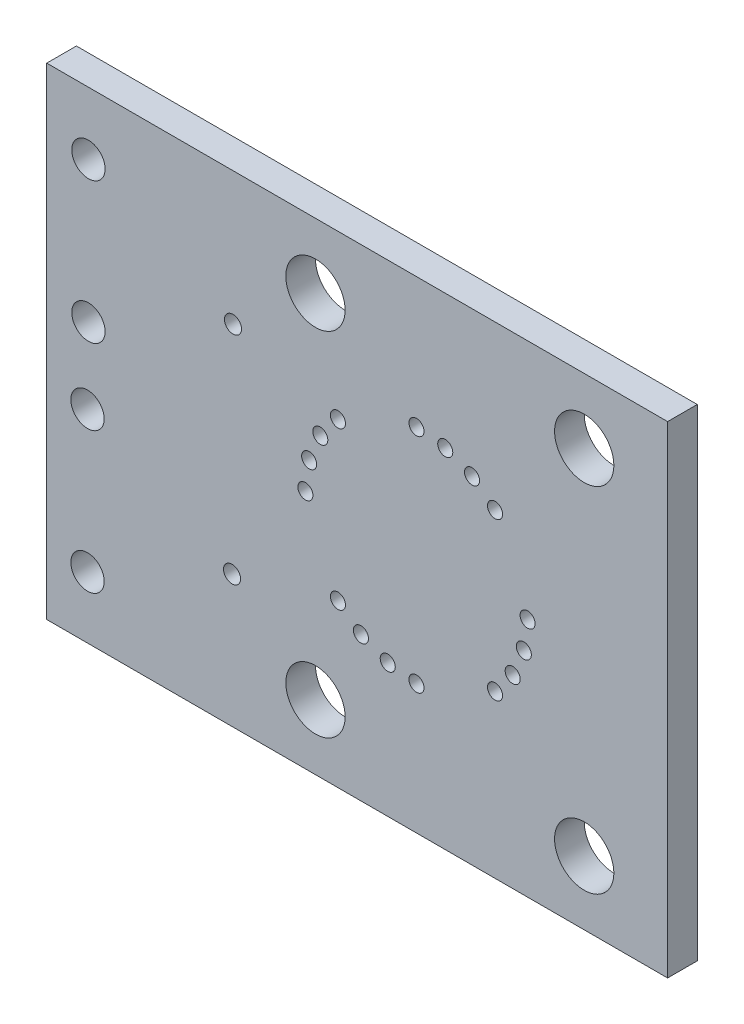
ISO-10303-21;
HEADER;
FILE_DESCRIPTION(('STEP AP214'),'2;1');
FILE_NAME('part.step','',(''),(''),'','','');
FILE_SCHEMA(('AUTOMOTIVE_DESIGN { 1 0 10303 214 1 1 1 1 }'));
ENDSEC;
DATA;
#1=APPLICATION_CONTEXT('core data for automotive mechanical design processes');
#2=APPLICATION_PROTOCOL_DEFINITION('international standard','automotive_design',2000,#1);
#3=PRODUCT_CONTEXT('',#1,'mechanical');
#4=PRODUCT('Part','Part','',(#3));
#5=PRODUCT_RELATED_PRODUCT_CATEGORY('part','',(#4));
#6=PRODUCT_DEFINITION_FORMATION('','',#4);
#7=PRODUCT_DEFINITION_CONTEXT('part definition',#1,'design');
#8=PRODUCT_DEFINITION('design','',#6,#7);
#9=PRODUCT_DEFINITION_SHAPE('','',#8);
#10=(LENGTH_UNIT() NAMED_UNIT(*) SI_UNIT(.MILLI.,.METRE.));
#11=(NAMED_UNIT(*) PLANE_ANGLE_UNIT() SI_UNIT($,.RADIAN.));
#12=(NAMED_UNIT(*) SI_UNIT($,.STERADIAN.) SOLID_ANGLE_UNIT());
#13=UNCERTAINTY_MEASURE_WITH_UNIT(LENGTH_MEASURE(1.E-05),#10,'distance_accuracy_value','');
#14=(GEOMETRIC_REPRESENTATION_CONTEXT(3) GLOBAL_UNCERTAINTY_ASSIGNED_CONTEXT((#13)) GLOBAL_UNIT_ASSIGNED_CONTEXT((#10,
#11,#12)) REPRESENTATION_CONTEXT('',''));
#15=CARTESIAN_POINT('',(0.,0.,0.));
#16=DIRECTION('',(0.,0.,1.));
#17=DIRECTION('',(1.,0.,0.));
#18=AXIS2_PLACEMENT_3D('',#15,#16,#17);
#19=CARTESIAN_POINT('',(16.75,13.,-1.6));
#20=DIRECTION('',(0.,0.,-1.));
#21=DIRECTION('',(0.,-1.,0.));
#22=AXIS2_PLACEMENT_3D('',#19,#20,#21);
#23=PLANE('',#22);
#24=CARTESIAN_POINT('',(2.25,22.625,-1.6));
#25=DIRECTION('',(0.,0.,1.));
#26=DIRECTION('',(1.,0.,0.));
#27=AXIS2_PLACEMENT_3D('',#24,#25,#26);
#28=CIRCLE('',#27,0.9);
#29=CARTESIAN_POINT('',(3.15000000000001,22.625,-1.6));
#30=VERTEX_POINT('',#29);
#31=EDGE_CURVE('E9',#30,#30,#28,.T.);
#32=ORIENTED_EDGE('',*,*,#31,.T.);
#33=EDGE_LOOP('',(#32));
#34=FACE_BOUND('',#33,.T.);
#35=CARTESIAN_POINT('',(14.5,22.5,-1.6));
#36=DIRECTION('',(0.,0.,1.));
#37=DIRECTION('',(1.,0.,0.));
#38=AXIS2_PLACEMENT_3D('',#35,#36,#37);
#39=CIRCLE('',#38,1.6);
#40=CARTESIAN_POINT('',(16.1,22.5,-1.6));
#41=VERTEX_POINT('',#40);
#42=EDGE_CURVE('E343',#41,#41,#39,.T.);
#43=ORIENTED_EDGE('',*,*,#42,.T.);
#44=EDGE_LOOP('',(#43));
#45=FACE_BOUND('',#44,.T.);
#46=CARTESIAN_POINT('',(10.05,18.825,-1.6));
#47=DIRECTION('',(0.,0.,1.));
#48=DIRECTION('',(1.,0.,0.));
#49=AXIS2_PLACEMENT_3D('',#46,#47,#48);
#50=CIRCLE('',#49,0.46);
#51=CARTESIAN_POINT('',(10.51,18.825,-1.6));
#52=VERTEX_POINT('',#51);
#53=EDGE_CURVE('E315',#52,#52,#50,.T.);
#54=ORIENTED_EDGE('',*,*,#53,.T.);
#55=EDGE_LOOP('',(#54));
#56=FACE_BOUND('',#55,.T.);
#57=CARTESIAN_POINT('',(2.25,15.025,-1.6));
#58=DIRECTION('',(0.,0.,1.));
#59=DIRECTION('',(1.,0.,0.));
#60=AXIS2_PLACEMENT_3D('',#57,#58,#59);
#61=CIRCLE('',#60,0.9);
#62=CARTESIAN_POINT('',(3.15000000000001,15.025,-1.6));
#63=VERTEX_POINT('',#62);
#64=EDGE_CURVE('E411',#63,#63,#61,.T.);
#65=ORIENTED_EDGE('',*,*,#64,.T.);
#66=EDGE_LOOP('',(#65));
#67=FACE_BOUND('',#66,.T.);
#68=CARTESIAN_POINT('',(15.711621,17.213681,-1.6));
#69=DIRECTION('',(0.,0.,1.));
#70=DIRECTION('',(1.,0.,0.));
#71=AXIS2_PLACEMENT_3D('',#68,#69,#70);
#72=CIRCLE('',#71,0.4064);
#73=CARTESIAN_POINT('',(16.118021,17.213681,-1.6));
#74=VERTEX_POINT('',#73);
#75=EDGE_CURVE('E399',#74,#74,#72,.T.);
#76=ORIENTED_EDGE('',*,*,#75,.T.);
#77=EDGE_LOOP('',(#76));
#78=FACE_BOUND('',#77,.T.);
#79=CARTESIAN_POINT('',(14.758999,15.9722,-1.6));
#80=DIRECTION('',(0.,0.,1.));
#81=DIRECTION('',(1.,0.,0.));
#82=AXIS2_PLACEMENT_3D('',#79,#80,#81);
#83=CIRCLE('',#82,0.4064);
#84=CARTESIAN_POINT('',(15.165399,15.9722,-1.6));
#85=VERTEX_POINT('',#84);
#86=EDGE_CURVE('E390',#85,#85,#83,.T.);
#87=ORIENTED_EDGE('',*,*,#86,.T.);
#88=EDGE_LOOP('',(#87));
#89=FACE_BOUND('',#88,.T.);
#90=CARTESIAN_POINT('',(14.160156,14.526465,-1.6));
#91=DIRECTION('',(0.,0.,1.));
#92=DIRECTION('',(1.,0.,0.));
#93=AXIS2_PLACEMENT_3D('',#90,#91,#92);
#94=CIRCLE('',#93,0.4064);
#95=CARTESIAN_POINT('',(14.566556,14.526465,-1.6));
#96=VERTEX_POINT('',#95);
#97=EDGE_CURVE('E344',#96,#96,#94,.T.);
#98=ORIENTED_EDGE('',*,*,#97,.T.);
#99=EDGE_LOOP('',(#98));
#100=FACE_BOUND('',#99,.T.);
#101=CARTESIAN_POINT('',(19.950302,18.9694,-1.6));
#102=DIRECTION('',(0.,0.,1.));
#103=DIRECTION('',(1.,0.,0.));
#104=AXIS2_PLACEMENT_3D('',#101,#102,#103);
#105=CIRCLE('',#104,0.4064);
#106=CARTESIAN_POINT('',(20.356702,18.9694,-1.6));
#107=VERTEX_POINT('',#106);
#108=EDGE_CURVE('E378',#107,#107,#105,.T.);
#109=ORIENTED_EDGE('',*,*,#108,.T.);
#110=EDGE_LOOP('',(#109));
#111=FACE_BOUND('',#110,.T.);
#112=CARTESIAN_POINT('',(21.501767,18.765146,-1.6));
#113=DIRECTION('',(0.,0.,1.));
#114=DIRECTION('',(1.,0.,0.));
#115=AXIS2_PLACEMENT_3D('',#112,#113,#114);
#116=CIRCLE('',#115,0.4064);
#117=CARTESIAN_POINT('',(21.908167,18.765146,-1.6));
#118=VERTEX_POINT('',#117);
#119=EDGE_CURVE('E375',#118,#118,#116,.T.);
#120=ORIENTED_EDGE('',*,*,#119,.T.);
#121=EDGE_LOOP('',(#120));
#122=FACE_BOUND('',#121,.T.);
#123=CARTESIAN_POINT('',(29.,22.5,-1.6));
#124=DIRECTION('',(0.,0.,1.));
#125=DIRECTION('',(1.,0.,0.));
#126=AXIS2_PLACEMENT_3D('',#123,#124,#125);
#127=CIRCLE('',#126,1.6);
#128=CARTESIAN_POINT('',(30.6,22.5,-1.6));
#129=VERTEX_POINT('',#128);
#130=EDGE_CURVE('E367',#129,#129,#127,.T.);
#131=ORIENTED_EDGE('',*,*,#130,.T.);
#132=EDGE_LOOP('',(#131));
#133=FACE_BOUND('',#132,.T.);
#134=CARTESIAN_POINT('',(22.947502,18.166303,-1.6));
#135=DIRECTION('',(0.,0.,1.));
#136=DIRECTION('',(1.,0.,0.));
#137=AXIS2_PLACEMENT_3D('',#134,#135,#136);
#138=CIRCLE('',#137,0.4064);
#139=CARTESIAN_POINT('',(23.353902,18.166303,-1.6));
#140=VERTEX_POINT('',#139);
#141=EDGE_CURVE('E359',#140,#140,#138,.T.);
#142=ORIENTED_EDGE('',*,*,#141,.T.);
#143=EDGE_LOOP('',(#142));
#144=FACE_BOUND('',#143,.T.);
#145=CARTESIAN_POINT('',(24.188983,17.213681,-1.6));
#146=DIRECTION('',(0.,0.,1.));
#147=DIRECTION('',(1.,0.,0.));
#148=AXIS2_PLACEMENT_3D('',#145,#146,#147);
#149=CIRCLE('',#148,0.4064);
#150=CARTESIAN_POINT('',(24.595383,17.213681,-1.6));
#151=VERTEX_POINT('',#150);
#152=EDGE_CURVE('E339',#151,#151,#149,.T.);
#153=ORIENTED_EDGE('',*,*,#152,.T.);
#154=EDGE_LOOP('',(#153));
#155=FACE_BOUND('',#154,.T.);
#156=CARTESIAN_POINT('',(2.20000000000001,10.925,-1.6));
#157=DIRECTION('',(0.,0.,1.));
#158=DIRECTION('',(1.,0.,0.));
#159=AXIS2_PLACEMENT_3D('',#156,#157,#158);
#160=CIRCLE('',#159,0.9);
#161=CARTESIAN_POINT('',(3.09999999999999,10.925,-1.6));
#162=VERTEX_POINT('',#161);
#163=EDGE_CURVE('E330',#162,#162,#160,.T.);
#164=ORIENTED_EDGE('',*,*,#163,.T.);
#165=EDGE_LOOP('',(#164));
#166=FACE_BOUND('',#165,.T.);
#167=CARTESIAN_POINT('',(13.955902,12.975,-1.6));
#168=DIRECTION('',(0.,0.,1.));
#169=DIRECTION('',(1.,0.,0.));
#170=AXIS2_PLACEMENT_3D('',#167,#168,#169);
#171=CIRCLE('',#170,0.4064);
#172=CARTESIAN_POINT('',(14.362302,12.975,-1.6));
#173=VERTEX_POINT('',#172);
#174=EDGE_CURVE('E319',#173,#173,#171,.T.);
#175=ORIENTED_EDGE('',*,*,#174,.T.);
#176=EDGE_LOOP('',(#175));
#177=FACE_BOUND('',#176,.T.);
#178=CARTESIAN_POINT('',(15.711621,8.73631900000001,-1.6));
#179=DIRECTION('',(0.,0.,1.));
#180=DIRECTION('',(1.,0.,0.));
#181=AXIS2_PLACEMENT_3D('',#178,#179,#180);
#182=CIRCLE('',#181,0.4064);
#183=CARTESIAN_POINT('',(16.118021,8.73631900000001,-1.6));
#184=VERTEX_POINT('',#183);
#185=EDGE_CURVE('E302',#184,#184,#182,.T.);
#186=ORIENTED_EDGE('',*,*,#185,.T.);
#187=EDGE_LOOP('',(#186));
#188=FACE_BOUND('',#187,.T.);
#189=CARTESIAN_POINT('',(2.20000000000001,3.32500000000001,-1.6));
#190=DIRECTION('',(0.,0.,1.));
#191=DIRECTION('',(1.,0.,0.));
#192=AXIS2_PLACEMENT_3D('',#189,#190,#191);
#193=CIRCLE('',#192,0.9);
#194=CARTESIAN_POINT('',(3.09999999999999,3.32500000000001,-1.6));
#195=VERTEX_POINT('',#194);
#196=EDGE_CURVE('E301',#195,#195,#193,.T.);
#197=ORIENTED_EDGE('',*,*,#196,.T.);
#198=EDGE_LOOP('',(#197));
#199=FACE_BOUND('',#198,.T.);
#200=CARTESIAN_POINT('',(10.,7.12500000000001,-1.6));
#201=DIRECTION('',(0.,0.,1.));
#202=DIRECTION('',(1.,0.,0.));
#203=AXIS2_PLACEMENT_3D('',#200,#201,#202);
#204=CIRCLE('',#203,0.46);
#205=CARTESIAN_POINT('',(10.46,7.12500000000001,-1.6));
#206=VERTEX_POINT('',#205);
#207=EDGE_CURVE('E274',#206,#206,#204,.T.);
#208=ORIENTED_EDGE('',*,*,#207,.T.);
#209=EDGE_LOOP('',(#208));
#210=FACE_BOUND('',#209,.T.);
#211=CARTESIAN_POINT('',(14.5,3.5,-1.6));
#212=DIRECTION('',(0.,0.,1.));
#213=DIRECTION('',(1.,0.,0.));
#214=AXIS2_PLACEMENT_3D('',#211,#212,#213);
#215=CIRCLE('',#214,1.6);
#216=CARTESIAN_POINT('',(16.1,3.5,-1.6));
#217=VERTEX_POINT('',#216);
#218=EDGE_CURVE('E589',#217,#217,#215,.T.);
#219=ORIENTED_EDGE('',*,*,#218,.T.);
#220=EDGE_LOOP('',(#219));
#221=FACE_BOUND('',#220,.T.);
#222=CARTESIAN_POINT('',(16.953102,7.78369700000001,-1.6));
#223=DIRECTION('',(0.,0.,1.));
#224=DIRECTION('',(1.,0.,0.));
#225=AXIS2_PLACEMENT_3D('',#222,#223,#224);
#226=CIRCLE('',#225,0.4064);
#227=CARTESIAN_POINT('',(17.359502,7.78369700000001,-1.6));
#228=VERTEX_POINT('',#227);
#229=EDGE_CURVE('E639',#228,#228,#226,.T.);
#230=ORIENTED_EDGE('',*,*,#229,.T.);
#231=EDGE_LOOP('',(#230));
#232=FACE_BOUND('',#231,.T.);
#233=CARTESIAN_POINT('',(25.944702,12.975,-1.6));
#234=DIRECTION('',(0.,0.,1.));
#235=DIRECTION('',(1.,0.,0.));
#236=AXIS2_PLACEMENT_3D('',#233,#234,#235);
#237=CIRCLE('',#236,0.4064);
#238=CARTESIAN_POINT('',(26.351102,12.975,-1.6));
#239=VERTEX_POINT('',#238);
#240=EDGE_CURVE('E619',#239,#239,#237,.T.);
#241=ORIENTED_EDGE('',*,*,#240,.T.);
#242=EDGE_LOOP('',(#241));
#243=FACE_BOUND('',#242,.T.);
#244=CARTESIAN_POINT('',(25.740448,11.423535,-1.6));
#245=DIRECTION('',(0.,0.,1.));
#246=DIRECTION('',(1.,0.,0.));
#247=AXIS2_PLACEMENT_3D('',#244,#245,#246);
#248=CIRCLE('',#247,0.4064);
#249=CARTESIAN_POINT('',(26.146848,11.423535,-1.6));
#250=VERTEX_POINT('',#249);
#251=EDGE_CURVE('E610',#250,#250,#248,.T.);
#252=ORIENTED_EDGE('',*,*,#251,.T.);
#253=EDGE_LOOP('',(#252));
#254=FACE_BOUND('',#253,.T.);
#255=CARTESIAN_POINT('',(25.141605,9.97780000000001,-1.6));
#256=DIRECTION('',(0.,0.,1.));
#257=DIRECTION('',(1.,0.,0.));
#258=AXIS2_PLACEMENT_3D('',#255,#256,#257);
#259=CIRCLE('',#258,0.4064);
#260=CARTESIAN_POINT('',(25.548005,9.97780000000001,-1.6));
#261=VERTEX_POINT('',#260);
#262=EDGE_CURVE('E540',#261,#261,#259,.T.);
#263=ORIENTED_EDGE('',*,*,#262,.T.);
#264=EDGE_LOOP('',(#263));
#265=FACE_BOUND('',#264,.T.);
#266=CARTESIAN_POINT('',(24.188983,8.73631900000001,-1.6));
#267=DIRECTION('',(0.,0.,1.));
#268=DIRECTION('',(1.,0.,0.));
#269=AXIS2_PLACEMENT_3D('',#266,#267,#268);
#270=CIRCLE('',#269,0.4064);
#271=CARTESIAN_POINT('',(24.595383,8.73631900000001,-1.6));
#272=VERTEX_POINT('',#271);
#273=EDGE_CURVE('E594',#272,#272,#270,.T.);
#274=ORIENTED_EDGE('',*,*,#273,.T.);
#275=EDGE_LOOP('',(#274));
#276=FACE_BOUND('',#275,.T.);
#277=CARTESIAN_POINT('',(18.398837,7.184854,-1.6));
#278=DIRECTION('',(0.,0.,1.));
#279=DIRECTION('',(1.,0.,0.));
#280=AXIS2_PLACEMENT_3D('',#277,#278,#279);
#281=CIRCLE('',#280,0.4064);
#282=CARTESIAN_POINT('',(18.805237,7.184854,-1.6));
#283=VERTEX_POINT('',#282);
#284=EDGE_CURVE('E586',#283,#283,#281,.T.);
#285=ORIENTED_EDGE('',*,*,#284,.T.);
#286=EDGE_LOOP('',(#285));
#287=FACE_BOUND('',#286,.T.);
#288=CARTESIAN_POINT('',(19.950302,6.9806,-1.6));
#289=DIRECTION('',(0.,0.,1.));
#290=DIRECTION('',(1.,0.,0.));
#291=AXIS2_PLACEMENT_3D('',#288,#289,#290);
#292=CIRCLE('',#291,0.4064);
#293=CARTESIAN_POINT('',(20.356702,6.9806,-1.6));
#294=VERTEX_POINT('',#293);
#295=EDGE_CURVE('E575',#294,#294,#292,.T.);
#296=ORIENTED_EDGE('',*,*,#295,.T.);
#297=EDGE_LOOP('',(#296));
#298=FACE_BOUND('',#297,.T.);
#299=CARTESIAN_POINT('',(29.,3.45000000000001,-1.6));
#300=DIRECTION('',(0.,0.,1.));
#301=DIRECTION('',(1.,0.,0.));
#302=AXIS2_PLACEMENT_3D('',#299,#300,#301);
#303=CIRCLE('',#302,1.6);
#304=CARTESIAN_POINT('',(30.6,3.45000000000001,-1.6));
#305=VERTEX_POINT('',#304);
#306=EDGE_CURVE('E534',#305,#305,#303,.T.);
#307=ORIENTED_EDGE('',*,*,#306,.T.);
#308=EDGE_LOOP('',(#307));
#309=FACE_BOUND('',#308,.T.);
#310=DIRECTION('',(1.,0.,0.));
#311=VECTOR('',#310,1.);
#312=CARTESIAN_POINT('',(0.,26.,-1.6));
#313=LINE('',#312,#311);
#314=CARTESIAN_POINT('',(0.,26.,-1.6));
#315=VERTEX_POINT('',#314);
#316=CARTESIAN_POINT('',(33.5,26.,-1.6));
#317=VERTEX_POINT('',#316);
#318=EDGE_CURVE('E529',#315,#317,#313,.T.);
#319=ORIENTED_EDGE('',*,*,#318,.T.);
#320=DIRECTION('',(0.,-1.,0.));
#321=VECTOR('',#320,1.);
#322=CARTESIAN_POINT('',(33.5,26.,-1.6));
#323=LINE('',#322,#321);
#324=CARTESIAN_POINT('',(33.5,0.,-1.6));
#325=VERTEX_POINT('',#324);
#326=EDGE_CURVE('E548',#317,#325,#323,.T.);
#327=ORIENTED_EDGE('',*,*,#326,.T.);
#328=DIRECTION('',(-1.,0.,0.));
#329=VECTOR('',#328,1.);
#330=CARTESIAN_POINT('',(33.5,0.,-1.6));
#331=LINE('',#330,#329);
#332=CARTESIAN_POINT('',(0.,0.,-1.6));
#333=VERTEX_POINT('',#332);
#334=EDGE_CURVE('E552',#325,#333,#331,.T.);
#335=ORIENTED_EDGE('',*,*,#334,.T.);
#336=DIRECTION('',(0.,1.,0.));
#337=VECTOR('',#336,1.);
#338=CARTESIAN_POINT('',(0.,0.,-1.6));
#339=LINE('',#338,#337);
#340=EDGE_CURVE('E520',#333,#315,#339,.T.);
#341=ORIENTED_EDGE('',*,*,#340,.T.);
#342=EDGE_LOOP('',(#319,#327,#335,#341));
#343=FACE_BOUND('',#342,.T.);
#344=ADVANCED_FACE('F15',(#34,#45,#56,#67,#78,#89,#100,#111,#122,#133,#144,#155,#166,#177,#188,
#199,#210,#221,#232,#243,#254,#265,#276,#287,#298,#309,#343),#23,.T.);
#345=CARTESIAN_POINT('',(16.75,13.,0.));
#346=DIRECTION('',(0.,0.,-1.));
#347=DIRECTION('',(0.,-1.,0.));
#348=AXIS2_PLACEMENT_3D('',#345,#346,#347);
#349=PLANE('',#348);
#350=CARTESIAN_POINT('',(2.25,22.625,0.));
#351=DIRECTION('',(0.,0.,1.));
#352=DIRECTION('',(1.,0.,0.));
#353=AXIS2_PLACEMENT_3D('',#350,#351,#352);
#354=CIRCLE('',#353,0.9);
#355=CARTESIAN_POINT('',(3.15000000000001,22.625,0.));
#356=VERTEX_POINT('',#355);
#357=EDGE_CURVE('E340',#356,#356,#354,.T.);
#358=ORIENTED_EDGE('',*,*,#357,.F.);
#359=EDGE_LOOP('',(#358));
#360=FACE_BOUND('',#359,.T.);
#361=CARTESIAN_POINT('',(14.5,22.5,0.));
#362=DIRECTION('',(0.,0.,1.));
#363=DIRECTION('',(1.,0.,0.));
#364=AXIS2_PLACEMENT_3D('',#361,#362,#363);
#365=CIRCLE('',#364,1.6);
#366=CARTESIAN_POINT('',(16.1,22.5,0.));
#367=VERTEX_POINT('',#366);
#368=EDGE_CURVE('E310',#367,#367,#365,.T.);
#369=ORIENTED_EDGE('',*,*,#368,.F.);
#370=EDGE_LOOP('',(#369));
#371=FACE_BOUND('',#370,.T.);
#372=CARTESIAN_POINT('',(10.05,18.825,0.));
#373=DIRECTION('',(0.,0.,1.));
#374=DIRECTION('',(1.,0.,0.));
#375=AXIS2_PLACEMENT_3D('',#372,#373,#374);
#376=CIRCLE('',#375,0.46);
#377=CARTESIAN_POINT('',(10.51,18.825,0.));
#378=VERTEX_POINT('',#377);
#379=EDGE_CURVE('E406',#378,#378,#376,.T.);
#380=ORIENTED_EDGE('',*,*,#379,.F.);
#381=EDGE_LOOP('',(#380));
#382=FACE_BOUND('',#381,.T.);
#383=CARTESIAN_POINT('',(2.25,15.025,0.));
#384=DIRECTION('',(0.,0.,1.));
#385=DIRECTION('',(1.,0.,0.));
#386=AXIS2_PLACEMENT_3D('',#383,#384,#385);
#387=CIRCLE('',#386,0.9);
#388=CARTESIAN_POINT('',(3.15000000000001,15.025,0.));
#389=VERTEX_POINT('',#388);
#390=EDGE_CURVE('E405',#389,#389,#387,.T.);
#391=ORIENTED_EDGE('',*,*,#390,.F.);
#392=EDGE_LOOP('',(#391));
#393=FACE_BOUND('',#392,.T.);
#394=CARTESIAN_POINT('',(15.711621,17.213681,0.));
#395=DIRECTION('',(0.,0.,1.));
#396=DIRECTION('',(1.,0.,0.));
#397=AXIS2_PLACEMENT_3D('',#394,#395,#396);
#398=CIRCLE('',#397,0.4064);
#399=CARTESIAN_POINT('',(16.118021,17.213681,0.));
#400=VERTEX_POINT('',#399);
#401=EDGE_CURVE('E391',#400,#400,#398,.T.);
#402=ORIENTED_EDGE('',*,*,#401,.F.);
#403=EDGE_LOOP('',(#402));
#404=FACE_BOUND('',#403,.T.);
#405=CARTESIAN_POINT('',(14.758999,15.9722,0.));
#406=DIRECTION('',(0.,0.,1.));
#407=DIRECTION('',(1.,0.,0.));
#408=AXIS2_PLACEMENT_3D('',#405,#406,#407);
#409=CIRCLE('',#408,0.4064);
#410=CARTESIAN_POINT('',(15.165399,15.9722,0.));
#411=VERTEX_POINT('',#410);
#412=EDGE_CURVE('E347',#411,#411,#409,.T.);
#413=ORIENTED_EDGE('',*,*,#412,.F.);
#414=EDGE_LOOP('',(#413));
#415=FACE_BOUND('',#414,.T.);
#416=CARTESIAN_POINT('',(14.160156,14.526465,0.));
#417=DIRECTION('',(0.,0.,1.));
#418=DIRECTION('',(1.,0.,0.));
#419=AXIS2_PLACEMENT_3D('',#416,#417,#418);
#420=CIRCLE('',#419,0.4064);
#421=CARTESIAN_POINT('',(14.566556,14.526465,0.));
#422=VERTEX_POINT('',#421);
#423=EDGE_CURVE('E381',#422,#422,#420,.T.);
#424=ORIENTED_EDGE('',*,*,#423,.F.);
#425=EDGE_LOOP('',(#424));
#426=FACE_BOUND('',#425,.T.);
#427=CARTESIAN_POINT('',(19.950302,18.9694,0.));
#428=DIRECTION('',(0.,0.,1.));
#429=DIRECTION('',(1.,0.,0.));
#430=AXIS2_PLACEMENT_3D('',#427,#428,#429);
#431=CIRCLE('',#430,0.4064);
#432=CARTESIAN_POINT('',(20.356702,18.9694,0.));
#433=VERTEX_POINT('',#432);
#434=EDGE_CURVE('E293',#433,#433,#431,.T.);
#435=ORIENTED_EDGE('',*,*,#434,.F.);
#436=EDGE_LOOP('',(#435));
#437=FACE_BOUND('',#436,.T.);
#438=CARTESIAN_POINT('',(21.501767,18.765146,0.));
#439=DIRECTION('',(0.,0.,1.));
#440=DIRECTION('',(1.,0.,0.));
#441=AXIS2_PLACEMENT_3D('',#438,#439,#440);
#442=CIRCLE('',#441,0.4064);
#443=CARTESIAN_POINT('',(21.908167,18.765146,0.));
#444=VERTEX_POINT('',#443);
#445=EDGE_CURVE('E370',#444,#444,#442,.T.);
#446=ORIENTED_EDGE('',*,*,#445,.F.);
#447=EDGE_LOOP('',(#446));
#448=FACE_BOUND('',#447,.T.);
#449=CARTESIAN_POINT('',(29.,22.5,0.));
#450=DIRECTION('',(0.,0.,1.));
#451=DIRECTION('',(1.,0.,0.));
#452=AXIS2_PLACEMENT_3D('',#449,#450,#451);
#453=CIRCLE('',#452,1.6);
#454=CARTESIAN_POINT('',(30.6,22.5,0.));
#455=VERTEX_POINT('',#454);
#456=EDGE_CURVE('E362',#455,#455,#453,.T.);
#457=ORIENTED_EDGE('',*,*,#456,.F.);
#458=EDGE_LOOP('',(#457));
#459=FACE_BOUND('',#458,.T.);
#460=CARTESIAN_POINT('',(22.947502,18.166303,0.));
#461=DIRECTION('',(0.,0.,1.));
#462=DIRECTION('',(1.,0.,0.));
#463=AXIS2_PLACEMENT_3D('',#460,#461,#462);
#464=CIRCLE('',#463,0.4064);
#465=CARTESIAN_POINT('',(23.353902,18.166303,0.));
#466=VERTEX_POINT('',#465);
#467=EDGE_CURVE('E351',#466,#466,#464,.T.);
#468=ORIENTED_EDGE('',*,*,#467,.F.);
#469=EDGE_LOOP('',(#468));
#470=FACE_BOUND('',#469,.T.);
#471=CARTESIAN_POINT('',(24.188983,17.213681,0.));
#472=DIRECTION('',(0.,0.,1.));
#473=DIRECTION('',(1.,0.,0.));
#474=AXIS2_PLACEMENT_3D('',#471,#472,#473);
#475=CIRCLE('',#474,0.4064);
#476=CARTESIAN_POINT('',(24.595383,17.213681,0.));
#477=VERTEX_POINT('',#476);
#478=EDGE_CURVE('E331',#477,#477,#475,.T.);
#479=ORIENTED_EDGE('',*,*,#478,.F.);
#480=EDGE_LOOP('',(#479));
#481=FACE_BOUND('',#480,.T.);
#482=CARTESIAN_POINT('',(2.20000000000001,10.925,0.));
#483=DIRECTION('',(0.,0.,1.));
#484=DIRECTION('',(1.,0.,0.));
#485=AXIS2_PLACEMENT_3D('',#482,#483,#484);
#486=CIRCLE('',#485,0.9);
#487=CARTESIAN_POINT('',(3.09999999999999,10.925,0.));
#488=VERTEX_POINT('',#487);
#489=EDGE_CURVE('E322',#488,#488,#486,.T.);
#490=ORIENTED_EDGE('',*,*,#489,.F.);
#491=EDGE_LOOP('',(#490));
#492=FACE_BOUND('',#491,.T.);
#493=CARTESIAN_POINT('',(13.955902,12.975,0.));
#494=DIRECTION('',(0.,0.,1.));
#495=DIRECTION('',(1.,0.,0.));
#496=AXIS2_PLACEMENT_3D('',#493,#494,#495);
#497=CIRCLE('',#496,0.4064);
#498=CARTESIAN_POINT('',(14.362302,12.975,0.));
#499=VERTEX_POINT('',#498);
#500=EDGE_CURVE('E305',#499,#499,#497,.T.);
#501=ORIENTED_EDGE('',*,*,#500,.F.);
#502=EDGE_LOOP('',(#501));
#503=FACE_BOUND('',#502,.T.);
#504=CARTESIAN_POINT('',(15.711621,8.73631900000001,0.));
#505=DIRECTION('',(0.,0.,1.));
#506=DIRECTION('',(1.,0.,0.));
#507=AXIS2_PLACEMENT_3D('',#504,#505,#506);
#508=CIRCLE('',#507,0.4064);
#509=CARTESIAN_POINT('',(16.118021,8.73631900000001,0.));
#510=VERTEX_POINT('',#509);
#511=EDGE_CURVE('E296',#510,#510,#508,.T.);
#512=ORIENTED_EDGE('',*,*,#511,.F.);
#513=EDGE_LOOP('',(#512));
#514=FACE_BOUND('',#513,.T.);
#515=CARTESIAN_POINT('',(2.20000000000001,3.32500000000001,0.));
#516=DIRECTION('',(0.,0.,1.));
#517=DIRECTION('',(1.,0.,0.));
#518=AXIS2_PLACEMENT_3D('',#515,#516,#517);
#519=CIRCLE('',#518,0.9);
#520=CARTESIAN_POINT('',(3.09999999999999,3.32500000000001,0.));
#521=VERTEX_POINT('',#520);
#522=EDGE_CURVE('E279',#521,#521,#519,.T.);
#523=ORIENTED_EDGE('',*,*,#522,.F.);
#524=EDGE_LOOP('',(#523));
#525=FACE_BOUND('',#524,.T.);
#526=CARTESIAN_POINT('',(10.,7.12500000000001,0.));
#527=DIRECTION('',(0.,0.,1.));
#528=DIRECTION('',(1.,0.,0.));
#529=AXIS2_PLACEMENT_3D('',#526,#527,#528);
#530=CIRCLE('',#529,0.46);
#531=CARTESIAN_POINT('',(10.46,7.12500000000001,0.));
#532=VERTEX_POINT('',#531);
#533=EDGE_CURVE('E290',#532,#532,#530,.T.);
#534=ORIENTED_EDGE('',*,*,#533,.F.);
#535=EDGE_LOOP('',(#534));
#536=FACE_BOUND('',#535,.T.);
#537=CARTESIAN_POINT('',(14.5,3.5,0.));
#538=DIRECTION('',(0.,0.,1.));
#539=DIRECTION('',(1.,0.,0.));
#540=AXIS2_PLACEMENT_3D('',#537,#538,#539);
#541=CIRCLE('',#540,1.6);
#542=CARTESIAN_POINT('',(16.1,3.5,0.));
#543=VERTEX_POINT('',#542);
#544=EDGE_CURVE('E475',#543,#543,#541,.T.);
#545=ORIENTED_EDGE('',*,*,#544,.F.);
#546=EDGE_LOOP('',(#545));
#547=FACE_BOUND('',#546,.T.);
#548=CARTESIAN_POINT('',(16.953102,7.78369700000001,0.));
#549=DIRECTION('',(0.,0.,1.));
#550=DIRECTION('',(1.,0.,0.));
#551=AXIS2_PLACEMENT_3D('',#548,#549,#550);
#552=CIRCLE('',#551,0.4064);
#553=CARTESIAN_POINT('',(17.359502,7.78369700000001,0.));
#554=VERTEX_POINT('',#553);
#555=EDGE_CURVE('E479',#554,#554,#552,.T.);
#556=ORIENTED_EDGE('',*,*,#555,.F.);
#557=EDGE_LOOP('',(#556));
#558=FACE_BOUND('',#557,.T.);
#559=CARTESIAN_POINT('',(25.944702,12.975,0.));
#560=DIRECTION('',(0.,0.,1.));
#561=DIRECTION('',(1.,0.,0.));
#562=AXIS2_PLACEMENT_3D('',#559,#560,#561);
#563=CIRCLE('',#562,0.4064);
#564=CARTESIAN_POINT('',(26.351102,12.975,0.));
#565=VERTEX_POINT('',#564);
#566=EDGE_CURVE('E483',#565,#565,#563,.T.);
#567=ORIENTED_EDGE('',*,*,#566,.F.);
#568=EDGE_LOOP('',(#567));
#569=FACE_BOUND('',#568,.T.);
#570=CARTESIAN_POINT('',(25.740448,11.423535,0.));
#571=DIRECTION('',(0.,0.,1.));
#572=DIRECTION('',(1.,0.,0.));
#573=AXIS2_PLACEMENT_3D('',#570,#571,#572);
#574=CIRCLE('',#573,0.4064);
#575=CARTESIAN_POINT('',(26.146848,11.423535,0.));
#576=VERTEX_POINT('',#575);
#577=EDGE_CURVE('E487',#576,#576,#574,.T.);
#578=ORIENTED_EDGE('',*,*,#577,.F.);
#579=EDGE_LOOP('',(#578));
#580=FACE_BOUND('',#579,.T.);
#581=CARTESIAN_POINT('',(25.141605,9.97780000000001,0.));
#582=DIRECTION('',(0.,0.,1.));
#583=DIRECTION('',(1.,0.,0.));
#584=AXIS2_PLACEMENT_3D('',#581,#582,#583);
#585=CIRCLE('',#584,0.4064);
#586=CARTESIAN_POINT('',(25.548005,9.97780000000001,0.));
#587=VERTEX_POINT('',#586);
#588=EDGE_CURVE('E491',#587,#587,#585,.T.);
#589=ORIENTED_EDGE('',*,*,#588,.F.);
#590=EDGE_LOOP('',(#589));
#591=FACE_BOUND('',#590,.T.);
#592=CARTESIAN_POINT('',(24.188983,8.73631900000001,0.));
#593=DIRECTION('',(0.,0.,1.));
#594=DIRECTION('',(1.,0.,0.));
#595=AXIS2_PLACEMENT_3D('',#592,#593,#594);
#596=CIRCLE('',#595,0.4064);
#597=CARTESIAN_POINT('',(24.595383,8.73631900000001,0.));
#598=VERTEX_POINT('',#597);
#599=EDGE_CURVE('E495',#598,#598,#596,.T.);
#600=ORIENTED_EDGE('',*,*,#599,.F.);
#601=EDGE_LOOP('',(#600));
#602=FACE_BOUND('',#601,.T.);
#603=CARTESIAN_POINT('',(18.398837,7.184854,0.));
#604=DIRECTION('',(0.,0.,1.));
#605=DIRECTION('',(1.,0.,0.));
#606=AXIS2_PLACEMENT_3D('',#603,#604,#605);
#607=CIRCLE('',#606,0.4064);
#608=CARTESIAN_POINT('',(18.805237,7.184854,0.));
#609=VERTEX_POINT('',#608);
#610=EDGE_CURVE('E499',#609,#609,#607,.T.);
#611=ORIENTED_EDGE('',*,*,#610,.F.);
#612=EDGE_LOOP('',(#611));
#613=FACE_BOUND('',#612,.T.);
#614=CARTESIAN_POINT('',(19.950302,6.9806,0.));
#615=DIRECTION('',(0.,0.,1.));
#616=DIRECTION('',(1.,0.,0.));
#617=AXIS2_PLACEMENT_3D('',#614,#615,#616);
#618=CIRCLE('',#617,0.4064);
#619=CARTESIAN_POINT('',(20.356702,6.9806,0.));
#620=VERTEX_POINT('',#619);
#621=EDGE_CURVE('E503',#620,#620,#618,.T.);
#622=ORIENTED_EDGE('',*,*,#621,.F.);
#623=EDGE_LOOP('',(#622));
#624=FACE_BOUND('',#623,.T.);
#625=CARTESIAN_POINT('',(29.,3.45000000000001,0.));
#626=DIRECTION('',(0.,0.,1.));
#627=DIRECTION('',(1.,0.,0.));
#628=AXIS2_PLACEMENT_3D('',#625,#626,#627);
#629=CIRCLE('',#628,1.6);
#630=CARTESIAN_POINT('',(30.6,3.45000000000001,0.));
#631=VERTEX_POINT('',#630);
#632=EDGE_CURVE('E507',#631,#631,#629,.T.);
#633=ORIENTED_EDGE('',*,*,#632,.F.);
#634=EDGE_LOOP('',(#633));
#635=FACE_BOUND('',#634,.T.);
#636=DIRECTION('',(0.,1.,0.));
#637=VECTOR('',#636,1.);
#638=CARTESIAN_POINT('',(0.,0.,0.));
#639=LINE('',#638,#637);
#640=CARTESIAN_POINT('',(0.,0.,0.));
#641=VERTEX_POINT('',#640);
#642=CARTESIAN_POINT('',(0.,26.,0.));
#643=VERTEX_POINT('',#642);
#644=EDGE_CURVE('E510',#641,#643,#639,.T.);
#645=ORIENTED_EDGE('',*,*,#644,.F.);
#646=DIRECTION('',(-1.,0.,0.));
#647=VECTOR('',#646,1.);
#648=CARTESIAN_POINT('',(33.5,0.,0.));
#649=LINE('',#648,#647);
#650=CARTESIAN_POINT('',(33.5,0.,0.));
#651=VERTEX_POINT('',#650);
#652=EDGE_CURVE('E511',#651,#641,#649,.T.);
#653=ORIENTED_EDGE('',*,*,#652,.F.);
#654=DIRECTION('',(0.,-1.,0.));
#655=VECTOR('',#654,1.);
#656=CARTESIAN_POINT('',(33.5,26.,0.));
#657=LINE('',#656,#655);
#658=CARTESIAN_POINT('',(33.5,26.,0.));
#659=VERTEX_POINT('',#658);
#660=EDGE_CURVE('E549',#659,#651,#657,.T.);
#661=ORIENTED_EDGE('',*,*,#660,.F.);
#662=DIRECTION('',(1.,0.,0.));
#663=VECTOR('',#662,1.);
#664=CARTESIAN_POINT('',(0.,26.,0.));
#665=LINE('',#664,#663);
#666=EDGE_CURVE('E514',#643,#659,#665,.T.);
#667=ORIENTED_EDGE('',*,*,#666,.F.);
#668=EDGE_LOOP('',(#645,#653,#661,#667));
#669=FACE_BOUND('',#668,.T.);
#670=ADVANCED_FACE('F433',(#360,#371,#382,#393,#404,#415,#426,#437,#448,#459,#470,#481,#492,
#503,#514,#525,#536,#547,#558,#569,#580,#591,#602,#613,#624,#635,#669),#349,.F.);
#671=CARTESIAN_POINT('',(2.25,22.625,0.));
#672=DIRECTION('',(0.,0.,1.));
#673=DIRECTION('',(1.,0.,0.));
#674=AXIS2_PLACEMENT_3D('',#671,#672,#673);
#675=CYLINDRICAL_SURFACE('',#674,0.9);
#676=ORIENTED_EDGE('',*,*,#357,.T.);
#677=DIRECTION('',(0.,0.,-1.));
#678=VECTOR('',#677,1.);
#679=CARTESIAN_POINT('',(3.15000000000001,22.625,0.));
#680=LINE('',#679,#678);
#681=EDGE_CURVE('E18',#356,#30,#680,.T.);
#682=ORIENTED_EDGE('',*,*,#681,.T.);
#683=ORIENTED_EDGE('',*,*,#31,.F.);
#684=ORIENTED_EDGE('',*,*,#681,.F.);
#685=EDGE_LOOP('',(#676,#682,#683,#684));
#686=FACE_BOUND('',#685,.T.);
#687=ADVANCED_FACE('F436',(#686),#675,.F.);
#688=CARTESIAN_POINT('',(14.5,22.5,0.));
#689=DIRECTION('',(0.,0.,1.));
#690=DIRECTION('',(1.,0.,0.));
#691=AXIS2_PLACEMENT_3D('',#688,#689,#690);
#692=CYLINDRICAL_SURFACE('',#691,1.6);
#693=ORIENTED_EDGE('',*,*,#368,.T.);
#694=DIRECTION('',(0.,0.,-1.));
#695=VECTOR('',#694,1.);
#696=CARTESIAN_POINT('',(16.1,22.5,0.));
#697=LINE('',#696,#695);
#698=EDGE_CURVE('E314',#367,#41,#697,.T.);
#699=ORIENTED_EDGE('',*,*,#698,.T.);
#700=ORIENTED_EDGE('',*,*,#42,.F.);
#701=ORIENTED_EDGE('',*,*,#698,.F.);
#702=EDGE_LOOP('',(#693,#699,#700,#701));
#703=FACE_BOUND('',#702,.T.);
#704=ADVANCED_FACE('F430',(#703),#692,.F.);
#705=CARTESIAN_POINT('',(10.05,18.825,0.));
#706=DIRECTION('',(0.,0.,1.));
#707=DIRECTION('',(1.,0.,0.));
#708=AXIS2_PLACEMENT_3D('',#705,#706,#707);
#709=CYLINDRICAL_SURFACE('',#708,0.46);
#710=ORIENTED_EDGE('',*,*,#379,.T.);
#711=DIRECTION('',(0.,0.,-1.));
#712=VECTOR('',#711,1.);
#713=CARTESIAN_POINT('',(10.51,18.825,0.));
#714=LINE('',#713,#712);
#715=EDGE_CURVE('E410',#378,#52,#714,.T.);
#716=ORIENTED_EDGE('',*,*,#715,.T.);
#717=ORIENTED_EDGE('',*,*,#53,.F.);
#718=ORIENTED_EDGE('',*,*,#715,.F.);
#719=EDGE_LOOP('',(#710,#716,#717,#718));
#720=FACE_BOUND('',#719,.T.);
#721=ADVANCED_FACE('F694',(#720),#709,.F.);
#722=CARTESIAN_POINT('',(2.25,15.025,0.));
#723=DIRECTION('',(0.,0.,1.));
#724=DIRECTION('',(1.,0.,0.));
#725=AXIS2_PLACEMENT_3D('',#722,#723,#724);
#726=CYLINDRICAL_SURFACE('',#725,0.9);
#727=ORIENTED_EDGE('',*,*,#390,.T.);
#728=DIRECTION('',(0.,0.,-1.));
#729=VECTOR('',#728,1.);
#730=CARTESIAN_POINT('',(3.15000000000001,15.025,0.));
#731=LINE('',#730,#729);
#732=EDGE_CURVE('E415',#389,#63,#731,.T.);
#733=ORIENTED_EDGE('',*,*,#732,.T.);
#734=ORIENTED_EDGE('',*,*,#64,.F.);
#735=ORIENTED_EDGE('',*,*,#732,.F.);
#736=EDGE_LOOP('',(#727,#733,#734,#735));
#737=FACE_BOUND('',#736,.T.);
#738=ADVANCED_FACE('F702',(#737),#726,.F.);
#739=CARTESIAN_POINT('',(15.711621,17.213681,0.));
#740=DIRECTION('',(0.,0.,1.));
#741=DIRECTION('',(1.,0.,0.));
#742=AXIS2_PLACEMENT_3D('',#739,#740,#741);
#743=CYLINDRICAL_SURFACE('',#742,0.4064);
#744=ORIENTED_EDGE('',*,*,#401,.T.);
#745=DIRECTION('',(0.,0.,-1.));
#746=VECTOR('',#745,1.);
#747=CARTESIAN_POINT('',(16.118021,17.213681,0.));
#748=LINE('',#747,#746);
#749=EDGE_CURVE('E395',#400,#74,#748,.T.);
#750=ORIENTED_EDGE('',*,*,#749,.T.);
#751=ORIENTED_EDGE('',*,*,#75,.F.);
#752=ORIENTED_EDGE('',*,*,#749,.F.);
#753=EDGE_LOOP('',(#744,#750,#751,#752));
#754=FACE_BOUND('',#753,.T.);
#755=ADVANCED_FACE('F711',(#754),#743,.F.);
#756=CARTESIAN_POINT('',(14.758999,15.9722,0.));
#757=DIRECTION('',(0.,0.,1.));
#758=DIRECTION('',(1.,0.,0.));
#759=AXIS2_PLACEMENT_3D('',#756,#757,#758);
#760=CYLINDRICAL_SURFACE('',#759,0.4064);
#761=ORIENTED_EDGE('',*,*,#412,.T.);
#762=DIRECTION('',(0.,0.,-1.));
#763=VECTOR('',#762,1.);
#764=CARTESIAN_POINT('',(15.165399,15.9722,0.));
#765=LINE('',#764,#763);
#766=EDGE_CURVE('E386',#411,#85,#765,.T.);
#767=ORIENTED_EDGE('',*,*,#766,.T.);
#768=ORIENTED_EDGE('',*,*,#86,.F.);
#769=ORIENTED_EDGE('',*,*,#766,.F.);
#770=EDGE_LOOP('',(#761,#767,#768,#769));
#771=FACE_BOUND('',#770,.T.);
#772=ADVANCED_FACE('F720',(#771),#760,.F.);
#773=CARTESIAN_POINT('',(14.160156,14.526465,0.));
#774=DIRECTION('',(0.,0.,1.));
#775=DIRECTION('',(1.,0.,0.));
#776=AXIS2_PLACEMENT_3D('',#773,#774,#775);
#777=CYLINDRICAL_SURFACE('',#776,0.4064);
#778=ORIENTED_EDGE('',*,*,#423,.T.);
#779=DIRECTION('',(0.,0.,-1.));
#780=VECTOR('',#779,1.);
#781=CARTESIAN_POINT('',(14.566556,14.526465,0.));
#782=LINE('',#781,#780);
#783=EDGE_CURVE('E348',#422,#96,#782,.T.);
#784=ORIENTED_EDGE('',*,*,#783,.T.);
#785=ORIENTED_EDGE('',*,*,#97,.F.);
#786=ORIENTED_EDGE('',*,*,#783,.F.);
#787=EDGE_LOOP('',(#778,#784,#785,#786));
#788=FACE_BOUND('',#787,.T.);
#789=ADVANCED_FACE('F729',(#788),#777,.F.);
#790=CARTESIAN_POINT('',(19.950302,18.9694,0.));
#791=DIRECTION('',(0.,0.,1.));
#792=DIRECTION('',(1.,0.,0.));
#793=AXIS2_PLACEMENT_3D('',#790,#791,#792);
#794=CYLINDRICAL_SURFACE('',#793,0.4064);
#795=ORIENTED_EDGE('',*,*,#434,.T.);
#796=DIRECTION('',(0.,0.,-1.));
#797=VECTOR('',#796,1.);
#798=CARTESIAN_POINT('',(20.356702,18.9694,0.));
#799=LINE('',#798,#797);
#800=EDGE_CURVE('E382',#433,#107,#799,.T.);
#801=ORIENTED_EDGE('',*,*,#800,.T.);
#802=ORIENTED_EDGE('',*,*,#108,.F.);
#803=ORIENTED_EDGE('',*,*,#800,.F.);
#804=EDGE_LOOP('',(#795,#801,#802,#803));
#805=FACE_BOUND('',#804,.T.);
#806=ADVANCED_FACE('F738',(#805),#794,.F.);
#807=CARTESIAN_POINT('',(21.501767,18.765146,0.));
#808=DIRECTION('',(0.,0.,1.));
#809=DIRECTION('',(1.,0.,0.));
#810=AXIS2_PLACEMENT_3D('',#807,#808,#809);
#811=CYLINDRICAL_SURFACE('',#810,0.4064);
#812=ORIENTED_EDGE('',*,*,#445,.T.);
#813=DIRECTION('',(0.,0.,-1.));
#814=VECTOR('',#813,1.);
#815=CARTESIAN_POINT('',(21.908167,18.765146,0.));
#816=LINE('',#815,#814);
#817=EDGE_CURVE('E374',#444,#118,#816,.T.);
#818=ORIENTED_EDGE('',*,*,#817,.T.);
#819=ORIENTED_EDGE('',*,*,#119,.F.);
#820=ORIENTED_EDGE('',*,*,#817,.F.);
#821=EDGE_LOOP('',(#812,#818,#819,#820));
#822=FACE_BOUND('',#821,.T.);
#823=ADVANCED_FACE('F747',(#822),#811,.F.);
#824=CARTESIAN_POINT('',(29.,22.5,0.));
#825=DIRECTION('',(0.,0.,1.));
#826=DIRECTION('',(1.,0.,0.));
#827=AXIS2_PLACEMENT_3D('',#824,#825,#826);
#828=CYLINDRICAL_SURFACE('',#827,1.6);
#829=ORIENTED_EDGE('',*,*,#456,.T.);
#830=DIRECTION('',(0.,0.,-1.));
#831=VECTOR('',#830,1.);
#832=CARTESIAN_POINT('',(30.6,22.5,0.));
#833=LINE('',#832,#831);
#834=EDGE_CURVE('E363',#455,#129,#833,.T.);
#835=ORIENTED_EDGE('',*,*,#834,.T.);
#836=ORIENTED_EDGE('',*,*,#130,.F.);
#837=ORIENTED_EDGE('',*,*,#834,.F.);
#838=EDGE_LOOP('',(#829,#835,#836,#837));
#839=FACE_BOUND('',#838,.T.);
#840=ADVANCED_FACE('F756',(#839),#828,.F.);
#841=CARTESIAN_POINT('',(22.947502,18.166303,0.));
#842=DIRECTION('',(0.,0.,1.));
#843=DIRECTION('',(1.,0.,0.));
#844=AXIS2_PLACEMENT_3D('',#841,#842,#843);
#845=CYLINDRICAL_SURFACE('',#844,0.4064);
#846=ORIENTED_EDGE('',*,*,#467,.T.);
#847=DIRECTION('',(0.,0.,-1.));
#848=VECTOR('',#847,1.);
#849=CARTESIAN_POINT('',(23.353902,18.166303,0.));
#850=LINE('',#849,#848);
#851=EDGE_CURVE('E355',#466,#140,#850,.T.);
#852=ORIENTED_EDGE('',*,*,#851,.T.);
#853=ORIENTED_EDGE('',*,*,#141,.F.);
#854=ORIENTED_EDGE('',*,*,#851,.F.);
#855=EDGE_LOOP('',(#846,#852,#853,#854));
#856=FACE_BOUND('',#855,.T.);
#857=ADVANCED_FACE('F765',(#856),#845,.F.);
#858=CARTESIAN_POINT('',(24.188983,17.213681,0.));
#859=DIRECTION('',(0.,0.,1.));
#860=DIRECTION('',(1.,0.,0.));
#861=AXIS2_PLACEMENT_3D('',#858,#859,#860);
#862=CYLINDRICAL_SURFACE('',#861,0.4064);
#863=ORIENTED_EDGE('',*,*,#478,.T.);
#864=DIRECTION('',(0.,0.,-1.));
#865=VECTOR('',#864,1.);
#866=CARTESIAN_POINT('',(24.595383,17.213681,0.));
#867=LINE('',#866,#865);
#868=EDGE_CURVE('E335',#477,#151,#867,.T.);
#869=ORIENTED_EDGE('',*,*,#868,.T.);
#870=ORIENTED_EDGE('',*,*,#152,.F.);
#871=ORIENTED_EDGE('',*,*,#868,.F.);
#872=EDGE_LOOP('',(#863,#869,#870,#871));
#873=FACE_BOUND('',#872,.T.);
#874=ADVANCED_FACE('F774',(#873),#862,.F.);
#875=CARTESIAN_POINT('',(2.20000000000001,10.925,0.));
#876=DIRECTION('',(0.,0.,1.));
#877=DIRECTION('',(1.,0.,0.));
#878=AXIS2_PLACEMENT_3D('',#875,#876,#877);
#879=CYLINDRICAL_SURFACE('',#878,0.9);
#880=ORIENTED_EDGE('',*,*,#489,.T.);
#881=DIRECTION('',(0.,0.,-1.));
#882=VECTOR('',#881,1.);
#883=CARTESIAN_POINT('',(3.09999999999999,10.925,0.));
#884=LINE('',#883,#882);
#885=EDGE_CURVE('E326',#488,#162,#884,.T.);
#886=ORIENTED_EDGE('',*,*,#885,.T.);
#887=ORIENTED_EDGE('',*,*,#163,.F.);
#888=ORIENTED_EDGE('',*,*,#885,.F.);
#889=EDGE_LOOP('',(#880,#886,#887,#888));
#890=FACE_BOUND('',#889,.T.);
#891=ADVANCED_FACE('F783',(#890),#879,.F.);
#892=CARTESIAN_POINT('',(13.955902,12.975,0.));
#893=DIRECTION('',(0.,0.,1.));
#894=DIRECTION('',(1.,0.,0.));
#895=AXIS2_PLACEMENT_3D('',#892,#893,#894);
#896=CYLINDRICAL_SURFACE('',#895,0.4064);
#897=ORIENTED_EDGE('',*,*,#500,.T.);
#898=DIRECTION('',(0.,0.,-1.));
#899=VECTOR('',#898,1.);
#900=CARTESIAN_POINT('',(14.362302,12.975,0.));
#901=LINE('',#900,#899);
#902=EDGE_CURVE('E309',#499,#173,#901,.T.);
#903=ORIENTED_EDGE('',*,*,#902,.T.);
#904=ORIENTED_EDGE('',*,*,#174,.F.);
#905=ORIENTED_EDGE('',*,*,#902,.F.);
#906=EDGE_LOOP('',(#897,#903,#904,#905));
#907=FACE_BOUND('',#906,.T.);
#908=ADVANCED_FACE('F792',(#907),#896,.F.);
#909=CARTESIAN_POINT('',(15.711621,8.73631900000001,0.));
#910=DIRECTION('',(0.,0.,1.));
#911=DIRECTION('',(1.,0.,0.));
#912=AXIS2_PLACEMENT_3D('',#909,#910,#911);
#913=CYLINDRICAL_SURFACE('',#912,0.4064);
#914=ORIENTED_EDGE('',*,*,#511,.T.);
#915=DIRECTION('',(0.,0.,-1.));
#916=VECTOR('',#915,1.);
#917=CARTESIAN_POINT('',(16.118021,8.73631900000001,0.));
#918=LINE('',#917,#916);
#919=EDGE_CURVE('E300',#510,#184,#918,.T.);
#920=ORIENTED_EDGE('',*,*,#919,.T.);
#921=ORIENTED_EDGE('',*,*,#185,.F.);
#922=ORIENTED_EDGE('',*,*,#919,.F.);
#923=EDGE_LOOP('',(#914,#920,#921,#922));
#924=FACE_BOUND('',#923,.T.);
#925=ADVANCED_FACE('F801',(#924),#913,.F.);
#926=CARTESIAN_POINT('',(2.20000000000001,3.32500000000001,0.));
#927=DIRECTION('',(0.,0.,1.));
#928=DIRECTION('',(1.,0.,0.));
#929=AXIS2_PLACEMENT_3D('',#926,#927,#928);
#930=CYLINDRICAL_SURFACE('',#929,0.9);
#931=ORIENTED_EDGE('',*,*,#522,.T.);
#932=DIRECTION('',(0.,0.,-1.));
#933=VECTOR('',#932,1.);
#934=CARTESIAN_POINT('',(3.09999999999999,3.32500000000001,0.));
#935=LINE('',#934,#933);
#936=EDGE_CURVE('E288',#521,#195,#935,.T.);
#937=ORIENTED_EDGE('',*,*,#936,.T.);
#938=ORIENTED_EDGE('',*,*,#196,.F.);
#939=ORIENTED_EDGE('',*,*,#936,.F.);
#940=EDGE_LOOP('',(#931,#937,#938,#939));
#941=FACE_BOUND('',#940,.T.);
#942=ADVANCED_FACE('F666',(#941),#930,.F.);
#943=CARTESIAN_POINT('',(10.,7.12500000000001,0.));
#944=DIRECTION('',(0.,0.,1.));
#945=DIRECTION('',(1.,0.,0.));
#946=AXIS2_PLACEMENT_3D('',#943,#944,#945);
#947=CYLINDRICAL_SURFACE('',#946,0.46);
#948=ORIENTED_EDGE('',*,*,#533,.T.);
#949=DIRECTION('',(0.,0.,-1.));
#950=VECTOR('',#949,1.);
#951=CARTESIAN_POINT('',(10.46,7.12500000000001,0.));
#952=LINE('',#951,#950);
#953=EDGE_CURVE('E280',#532,#206,#952,.T.);
#954=ORIENTED_EDGE('',*,*,#953,.T.);
#955=ORIENTED_EDGE('',*,*,#207,.F.);
#956=ORIENTED_EDGE('',*,*,#953,.F.);
#957=EDGE_LOOP('',(#948,#954,#955,#956));
#958=FACE_BOUND('',#957,.T.);
#959=ADVANCED_FACE('F656',(#958),#947,.F.);
#960=CARTESIAN_POINT('',(14.5,3.5,0.));
#961=DIRECTION('',(0.,0.,1.));
#962=DIRECTION('',(1.,0.,0.));
#963=AXIS2_PLACEMENT_3D('',#960,#961,#962);
#964=CYLINDRICAL_SURFACE('',#963,1.6);
#965=ORIENTED_EDGE('',*,*,#544,.T.);
#966=DIRECTION('',(0.,0.,-1.));
#967=VECTOR('',#966,1.);
#968=CARTESIAN_POINT('',(16.1,3.5,0.));
#969=LINE('',#968,#967);
#970=EDGE_CURVE('E644',#543,#217,#969,.T.);
#971=ORIENTED_EDGE('',*,*,#970,.T.);
#972=ORIENTED_EDGE('',*,*,#218,.F.);
#973=ORIENTED_EDGE('',*,*,#970,.F.);
#974=EDGE_LOOP('',(#965,#971,#972,#973));
#975=FACE_BOUND('',#974,.T.);
#976=ADVANCED_FACE('F653',(#975),#964,.F.);
#977=CARTESIAN_POINT('',(16.953102,7.78369700000001,0.));
#978=DIRECTION('',(0.,0.,1.));
#979=DIRECTION('',(1.,0.,0.));
#980=AXIS2_PLACEMENT_3D('',#977,#978,#979);
#981=CYLINDRICAL_SURFACE('',#980,0.4064);
#982=ORIENTED_EDGE('',*,*,#555,.T.);
#983=DIRECTION('',(0.,0.,-1.));
#984=VECTOR('',#983,1.);
#985=CARTESIAN_POINT('',(17.359502,7.78369700000001,0.));
#986=LINE('',#985,#984);
#987=EDGE_CURVE('E635',#554,#228,#986,.T.);
#988=ORIENTED_EDGE('',*,*,#987,.T.);
#989=ORIENTED_EDGE('',*,*,#229,.F.);
#990=ORIENTED_EDGE('',*,*,#987,.F.);
#991=EDGE_LOOP('',(#982,#988,#989,#990));
#992=FACE_BOUND('',#991,.T.);
#993=ADVANCED_FACE('F655',(#992),#981,.F.);
#994=CARTESIAN_POINT('',(25.944702,12.975,0.));
#995=DIRECTION('',(0.,0.,1.));
#996=DIRECTION('',(1.,0.,0.));
#997=AXIS2_PLACEMENT_3D('',#994,#995,#996);
#998=CYLINDRICAL_SURFACE('',#997,0.4064);
#999=ORIENTED_EDGE('',*,*,#566,.T.);
#1000=DIRECTION('',(0.,0.,-1.));
#1001=VECTOR('',#1000,1.);
#1002=CARTESIAN_POINT('',(26.351102,12.975,0.));
#1003=LINE('',#1002,#1001);
#1004=EDGE_CURVE('E615',#565,#239,#1003,.T.);
#1005=ORIENTED_EDGE('',*,*,#1004,.T.);
#1006=ORIENTED_EDGE('',*,*,#240,.F.);
#1007=ORIENTED_EDGE('',*,*,#1004,.F.);
#1008=EDGE_LOOP('',(#999,#1005,#1006,#1007));
#1009=FACE_BOUND('',#1008,.T.);
#1010=ADVANCED_FACE('F663',(#1009),#998,.F.);
#1011=CARTESIAN_POINT('',(25.740448,11.423535,0.));
#1012=DIRECTION('',(0.,0.,1.));
#1013=DIRECTION('',(1.,0.,0.));
#1014=AXIS2_PLACEMENT_3D('',#1011,#1012,#1013);
#1015=CYLINDRICAL_SURFACE('',#1014,0.4064);
#1016=ORIENTED_EDGE('',*,*,#577,.T.);
#1017=DIRECTION('',(0.,0.,-1.));
#1018=VECTOR('',#1017,1.);
#1019=CARTESIAN_POINT('',(26.146848,11.423535,0.));
#1020=LINE('',#1019,#1018);
#1021=EDGE_CURVE('E606',#576,#250,#1020,.T.);
#1022=ORIENTED_EDGE('',*,*,#1021,.T.);
#1023=ORIENTED_EDGE('',*,*,#251,.F.);
#1024=ORIENTED_EDGE('',*,*,#1021,.F.);
#1025=EDGE_LOOP('',(#1016,#1022,#1023,#1024));
#1026=FACE_BOUND('',#1025,.T.);
#1027=ADVANCED_FACE('F849',(#1026),#1015,.F.);
#1028=CARTESIAN_POINT('',(25.141605,9.97780000000001,0.));
#1029=DIRECTION('',(0.,0.,1.));
#1030=DIRECTION('',(1.,0.,0.));
#1031=AXIS2_PLACEMENT_3D('',#1028,#1029,#1030);
#1032=CYLINDRICAL_SURFACE('',#1031,0.4064);
#1033=ORIENTED_EDGE('',*,*,#588,.T.);
#1034=DIRECTION('',(0.,0.,-1.));
#1035=VECTOR('',#1034,1.);
#1036=CARTESIAN_POINT('',(25.548005,9.97780000000001,0.));
#1037=LINE('',#1036,#1035);
#1038=EDGE_CURVE('E543',#587,#261,#1037,.T.);
#1039=ORIENTED_EDGE('',*,*,#1038,.T.);
#1040=ORIENTED_EDGE('',*,*,#262,.F.);
#1041=ORIENTED_EDGE('',*,*,#1038,.F.);
#1042=EDGE_LOOP('',(#1033,#1039,#1040,#1041));
#1043=FACE_BOUND('',#1042,.T.);
#1044=ADVANCED_FACE('F860',(#1043),#1032,.F.);
#1045=CARTESIAN_POINT('',(24.188983,8.73631900000001,0.));
#1046=DIRECTION('',(0.,0.,1.));
#1047=DIRECTION('',(1.,0.,0.));
#1048=AXIS2_PLACEMENT_3D('',#1045,#1046,#1047);
#1049=CYLINDRICAL_SURFACE('',#1048,0.4064);
#1050=ORIENTED_EDGE('',*,*,#599,.T.);
#1051=DIRECTION('',(0.,0.,-1.));
#1052=VECTOR('',#1051,1.);
#1053=CARTESIAN_POINT('',(24.595383,8.73631900000001,0.));
#1054=LINE('',#1053,#1052);
#1055=EDGE_CURVE('E590',#598,#272,#1054,.T.);
#1056=ORIENTED_EDGE('',*,*,#1055,.T.);
#1057=ORIENTED_EDGE('',*,*,#273,.F.);
#1058=ORIENTED_EDGE('',*,*,#1055,.F.);
#1059=EDGE_LOOP('',(#1050,#1056,#1057,#1058));
#1060=FACE_BOUND('',#1059,.T.);
#1061=ADVANCED_FACE('F871',(#1060),#1049,.F.);
#1062=CARTESIAN_POINT('',(18.398837,7.184854,0.));
#1063=DIRECTION('',(0.,0.,1.));
#1064=DIRECTION('',(1.,0.,0.));
#1065=AXIS2_PLACEMENT_3D('',#1062,#1063,#1064);
#1066=CYLINDRICAL_SURFACE('',#1065,0.4064);
#1067=ORIENTED_EDGE('',*,*,#610,.T.);
#1068=DIRECTION('',(0.,0.,-1.));
#1069=VECTOR('',#1068,1.);
#1070=CARTESIAN_POINT('',(18.805237,7.184854,0.));
#1071=LINE('',#1070,#1069);
#1072=EDGE_CURVE('E574',#609,#283,#1071,.T.);
#1073=ORIENTED_EDGE('',*,*,#1072,.T.);
#1074=ORIENTED_EDGE('',*,*,#284,.F.);
#1075=ORIENTED_EDGE('',*,*,#1072,.F.);
#1076=EDGE_LOOP('',(#1067,#1073,#1074,#1075));
#1077=FACE_BOUND('',#1076,.T.);
#1078=ADVANCED_FACE('F882',(#1077),#1066,.F.);
#1079=CARTESIAN_POINT('',(19.950302,6.9806,0.));
#1080=DIRECTION('',(0.,0.,1.));
#1081=DIRECTION('',(1.,0.,0.));
#1082=AXIS2_PLACEMENT_3D('',#1079,#1080,#1081);
#1083=CYLINDRICAL_SURFACE('',#1082,0.4064);
#1084=ORIENTED_EDGE('',*,*,#621,.T.);
#1085=DIRECTION('',(0.,0.,-1.));
#1086=VECTOR('',#1085,1.);
#1087=CARTESIAN_POINT('',(20.356702,6.9806,0.));
#1088=LINE('',#1087,#1086);
#1089=EDGE_CURVE('E564',#620,#294,#1088,.T.);
#1090=ORIENTED_EDGE('',*,*,#1089,.T.);
#1091=ORIENTED_EDGE('',*,*,#295,.F.);
#1092=ORIENTED_EDGE('',*,*,#1089,.F.);
#1093=EDGE_LOOP('',(#1084,#1090,#1091,#1092));
#1094=FACE_BOUND('',#1093,.T.);
#1095=ADVANCED_FACE('F893',(#1094),#1083,.F.);
#1096=CARTESIAN_POINT('',(29.,3.45000000000001,0.));
#1097=DIRECTION('',(0.,0.,1.));
#1098=DIRECTION('',(1.,0.,0.));
#1099=AXIS2_PLACEMENT_3D('',#1096,#1097,#1098);
#1100=CYLINDRICAL_SURFACE('',#1099,1.6);
#1101=ORIENTED_EDGE('',*,*,#632,.T.);
#1102=DIRECTION('',(0.,0.,-1.));
#1103=VECTOR('',#1102,1.);
#1104=CARTESIAN_POINT('',(30.6,3.45000000000001,0.));
#1105=LINE('',#1104,#1103);
#1106=EDGE_CURVE('E536',#631,#305,#1105,.T.);
#1107=ORIENTED_EDGE('',*,*,#1106,.T.);
#1108=ORIENTED_EDGE('',*,*,#306,.F.);
#1109=ORIENTED_EDGE('',*,*,#1106,.F.);
#1110=EDGE_LOOP('',(#1101,#1107,#1108,#1109));
#1111=FACE_BOUND('',#1110,.T.);
#1112=ADVANCED_FACE('F904',(#1111),#1100,.F.);
#1113=CARTESIAN_POINT('',(33.5,0.,0.));
#1114=DIRECTION('',(0.,1.,0.));
#1115=DIRECTION('',(1.,0.,0.));
#1116=AXIS2_PLACEMENT_3D('',#1113,#1114,#1115);
#1117=PLANE('',#1116);
#1118=ORIENTED_EDGE('',*,*,#652,.T.);
#1119=DIRECTION('',(0.,0.,-1.));
#1120=VECTOR('',#1119,1.);
#1121=CARTESIAN_POINT('',(0.,0.,0.));
#1122=LINE('',#1121,#1120);
#1123=EDGE_CURVE('E527',#641,#333,#1122,.T.);
#1124=ORIENTED_EDGE('',*,*,#1123,.T.);
#1125=ORIENTED_EDGE('',*,*,#334,.F.);
#1126=DIRECTION('',(0.,0.,-1.));
#1127=VECTOR('',#1126,1.);
#1128=CARTESIAN_POINT('',(33.5,0.,0.));
#1129=LINE('',#1128,#1127);
#1130=EDGE_CURVE('E544',#651,#325,#1129,.T.);
#1131=ORIENTED_EDGE('',*,*,#1130,.F.);
#1132=EDGE_LOOP('',(#1118,#1124,#1125,#1131));
#1133=FACE_BOUND('',#1132,.T.);
#1134=ADVANCED_FACE('F915',(#1133),#1117,.F.);
#1135=CARTESIAN_POINT('',(33.5,26.,0.));
#1136=DIRECTION('',(-1.,0.,0.));
#1137=DIRECTION('',(0.,0.,1.));
#1138=AXIS2_PLACEMENT_3D('',#1135,#1136,#1137);
#1139=PLANE('',#1138);
#1140=ORIENTED_EDGE('',*,*,#660,.T.);
#1141=ORIENTED_EDGE('',*,*,#1130,.T.);
#1142=ORIENTED_EDGE('',*,*,#326,.F.);
#1143=DIRECTION('',(0.,0.,-1.));
#1144=VECTOR('',#1143,1.);
#1145=CARTESIAN_POINT('',(33.5,26.,0.));
#1146=LINE('',#1145,#1144);
#1147=EDGE_CURVE('E1088',#659,#317,#1146,.T.);
#1148=ORIENTED_EDGE('',*,*,#1147,.F.);
#1149=EDGE_LOOP('',(#1140,#1141,#1142,#1148));
#1150=FACE_BOUND('',#1149,.T.);
#1151=ADVANCED_FACE('F926',(#1150),#1139,.F.);
#1152=CARTESIAN_POINT('',(0.,0.,0.));
#1153=DIRECTION('',(1.,0.,0.));
#1154=DIRECTION('',(0.,1.,0.));
#1155=AXIS2_PLACEMENT_3D('',#1152,#1153,#1154);
#1156=PLANE('',#1155);
#1157=ORIENTED_EDGE('',*,*,#644,.T.);
#1158=DIRECTION('',(0.,0.,-1.));
#1159=VECTOR('',#1158,1.);
#1160=CARTESIAN_POINT('',(0.,26.,0.));
#1161=LINE('',#1160,#1159);
#1162=EDGE_CURVE('E521',#643,#315,#1161,.T.);
#1163=ORIENTED_EDGE('',*,*,#1162,.T.);
#1164=ORIENTED_EDGE('',*,*,#340,.F.);
#1165=ORIENTED_EDGE('',*,*,#1123,.F.);
#1166=EDGE_LOOP('',(#1157,#1163,#1164,#1165));
#1167=FACE_BOUND('',#1166,.T.);
#1168=ADVANCED_FACE('F937',(#1167),#1156,.F.);
#1169=CARTESIAN_POINT('',(0.,26.,0.));
#1170=DIRECTION('',(0.,-1.,0.));
#1171=DIRECTION('',(0.,0.,-1.));
#1172=AXIS2_PLACEMENT_3D('',#1169,#1170,#1171);
#1173=PLANE('',#1172);
#1174=ORIENTED_EDGE('',*,*,#666,.T.);
#1175=ORIENTED_EDGE('',*,*,#1147,.T.);
#1176=ORIENTED_EDGE('',*,*,#318,.F.);
#1177=ORIENTED_EDGE('',*,*,#1162,.F.);
#1178=EDGE_LOOP('',(#1174,#1175,#1176,#1177));
#1179=FACE_BOUND('',#1178,.T.);
#1180=ADVANCED_FACE('F948',(#1179),#1173,.F.);
#1181=CLOSED_SHELL('',(#344,#670,#687,#704,#721,#738,#755,#772,#789,#806,#823,#840,#857,#874,
#891,#908,#925,#942,#959,#976,#993,#1010,#1027,#1044,#1061,#1078,#1095,#1112,#1134,#1151,#1168,#1180));
#1182=MANIFOLD_SOLID_BREP('B1',#1181);
#1183=ADVANCED_BREP_SHAPE_REPRESENTATION('',(#18,#1182),#14);
#1184=SHAPE_DEFINITION_REPRESENTATION(#9,#1183);
ENDSEC;
END-ISO-10303-21;
